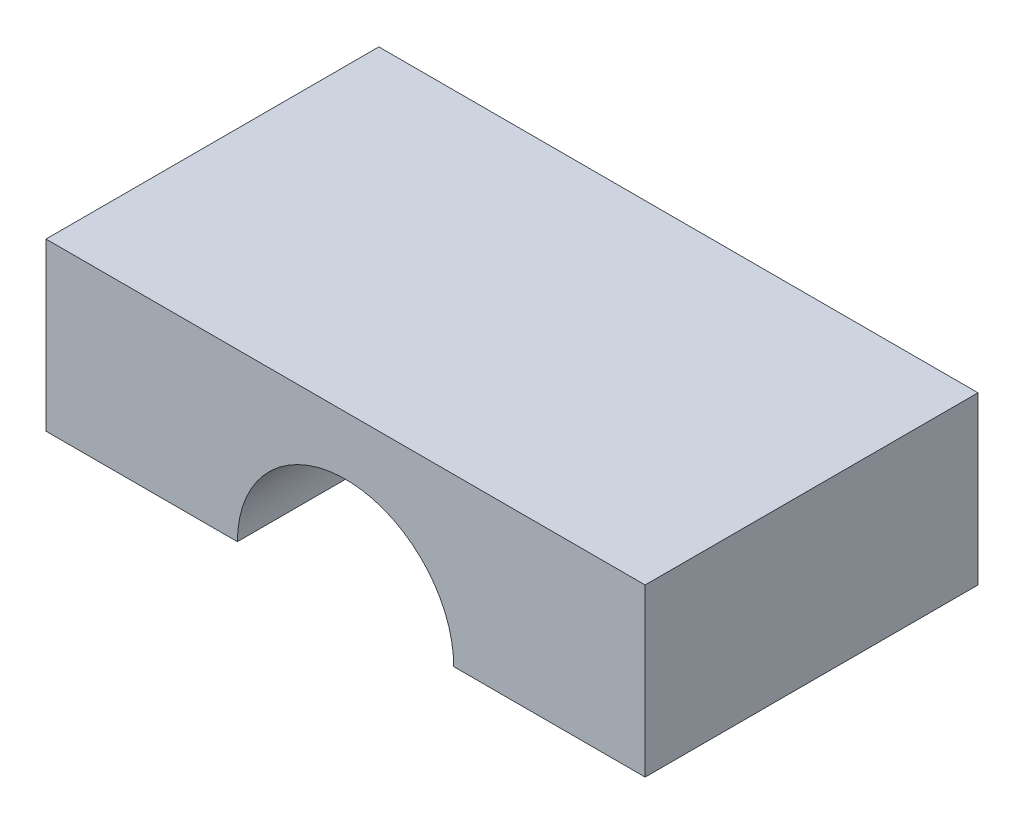
ISO-10303-21;
HEADER;
FILE_DESCRIPTION(('STEP AP214'),'2;1');
FILE_NAME('part.step','',(''),(''),'','','');
FILE_SCHEMA(('AUTOMOTIVE_DESIGN { 1 0 10303 214 1 1 1 1 }'));
ENDSEC;
DATA;
#1=APPLICATION_CONTEXT('core data for automotive mechanical design processes');
#2=APPLICATION_PROTOCOL_DEFINITION('international standard','automotive_design',2000,#1);
#3=PRODUCT_CONTEXT('',#1,'mechanical');
#4=PRODUCT('Part','Part','',(#3));
#5=PRODUCT_RELATED_PRODUCT_CATEGORY('part','',(#4));
#6=PRODUCT_DEFINITION_FORMATION('','',#4);
#7=PRODUCT_DEFINITION_CONTEXT('part definition',#1,'design');
#8=PRODUCT_DEFINITION('design','',#6,#7);
#9=PRODUCT_DEFINITION_SHAPE('','',#8);
#10=(LENGTH_UNIT() NAMED_UNIT(*) SI_UNIT(.MILLI.,.METRE.));
#11=(NAMED_UNIT(*) PLANE_ANGLE_UNIT() SI_UNIT($,.RADIAN.));
#12=(NAMED_UNIT(*) SI_UNIT($,.STERADIAN.) SOLID_ANGLE_UNIT());
#13=UNCERTAINTY_MEASURE_WITH_UNIT(LENGTH_MEASURE(1.E-05),#10,'distance_accuracy_value','');
#14=(GEOMETRIC_REPRESENTATION_CONTEXT(3) GLOBAL_UNCERTAINTY_ASSIGNED_CONTEXT((#13)) GLOBAL_UNIT_ASSIGNED_CONTEXT((#10,
#11,#12)) REPRESENTATION_CONTEXT('',''));
#15=CARTESIAN_POINT('',(0.,0.,0.));
#16=DIRECTION('',(0.,0.,1.));
#17=DIRECTION('',(1.,0.,0.));
#18=AXIS2_PLACEMENT_3D('',#15,#16,#17);
#19=CARTESIAN_POINT('',(0.,0.,10.));
#20=DIRECTION('',(0.,0.,-1.));
#21=DIRECTION('',(-1.,0.,0.));
#22=AXIS2_PLACEMENT_3D('',#19,#20,#21);
#23=CYLINDRICAL_SURFACE('',#22,3.25);
#24=CARTESIAN_POINT('',(0.,0.,0.));
#25=DIRECTION('',(0.,0.,-1.));
#26=DIRECTION('',(1.,0.,0.));
#27=AXIS2_PLACEMENT_3D('',#24,#25,#26);
#28=CIRCLE('',#27,3.25);
#29=CARTESIAN_POINT('',(-3.25,0.,0.));
#30=VERTEX_POINT('',#29);
#31=CARTESIAN_POINT('',(3.25,0.,0.));
#32=VERTEX_POINT('',#31);
#33=EDGE_CURVE('E117',#30,#32,#28,.T.);
#34=ORIENTED_EDGE('',*,*,#33,.T.);
#35=DIRECTION('',(0.,0.,-1.));
#36=VECTOR('',#35,1.);
#37=CARTESIAN_POINT('',(3.25,0.,10.));
#38=LINE('',#37,#36);
#39=CARTESIAN_POINT('',(3.25,0.,10.));
#40=VERTEX_POINT('',#39);
#41=EDGE_CURVE('E11',#40,#32,#38,.T.);
#42=ORIENTED_EDGE('',*,*,#41,.F.);
#43=CARTESIAN_POINT('',(0.,0.,10.));
#44=DIRECTION('',(0.,0.,-1.));
#45=DIRECTION('',(1.,0.,0.));
#46=AXIS2_PLACEMENT_3D('',#43,#44,#45);
#47=CIRCLE('',#46,3.25);
#48=CARTESIAN_POINT('',(-3.25,0.,10.));
#49=VERTEX_POINT('',#48);
#50=EDGE_CURVE('E127',#49,#40,#47,.T.);
#51=ORIENTED_EDGE('',*,*,#50,.F.);
#52=DIRECTION('',(0.,0.,-1.));
#53=VECTOR('',#52,1.);
#54=CARTESIAN_POINT('',(-3.25,0.,10.));
#55=LINE('',#54,#53);
#56=EDGE_CURVE('E113',#49,#30,#55,.T.);
#57=ORIENTED_EDGE('',*,*,#56,.T.);
#58=EDGE_LOOP('',(#34,#42,#51,#57));
#59=FACE_BOUND('',#58,.T.);
#60=ADVANCED_FACE('F33',(#59),#23,.F.);
#61=CARTESIAN_POINT('',(3.25,0.,10.));
#62=DIRECTION('',(0.,1.,0.));
#63=DIRECTION('',(-1.,0.,0.));
#64=AXIS2_PLACEMENT_3D('',#61,#62,#63);
#65=PLANE('',#64);
#66=DIRECTION('',(1.,0.,0.));
#67=VECTOR('',#66,1.);
#68=CARTESIAN_POINT('',(3.25,0.,0.));
#69=LINE('',#68,#67);
#70=CARTESIAN_POINT('',(9.,0.,0.));
#71=VERTEX_POINT('',#70);
#72=EDGE_CURVE('E120',#32,#71,#69,.T.);
#73=ORIENTED_EDGE('',*,*,#72,.T.);
#74=DIRECTION('',(0.,0.,-1.));
#75=VECTOR('',#74,1.);
#76=CARTESIAN_POINT('',(9.,0.,10.));
#77=LINE('',#76,#75);
#78=CARTESIAN_POINT('',(9.,0.,10.));
#79=VERTEX_POINT('',#78);
#80=EDGE_CURVE('E41',#79,#71,#77,.T.);
#81=ORIENTED_EDGE('',*,*,#80,.F.);
#82=DIRECTION('',(1.,0.,0.));
#83=VECTOR('',#82,1.);
#84=CARTESIAN_POINT('',(3.25,0.,10.));
#85=LINE('',#84,#83);
#86=EDGE_CURVE('E86',#40,#79,#85,.T.);
#87=ORIENTED_EDGE('',*,*,#86,.F.);
#88=ORIENTED_EDGE('',*,*,#41,.T.);
#89=EDGE_LOOP('',(#73,#81,#87,#88));
#90=FACE_BOUND('',#89,.T.);
#91=ADVANCED_FACE('F151',(#90),#65,.F.);
#92=CARTESIAN_POINT('',(9.,0.,10.));
#93=DIRECTION('',(-1.,0.,0.));
#94=DIRECTION('',(0.,0.,1.));
#95=AXIS2_PLACEMENT_3D('',#92,#93,#94);
#96=PLANE('',#95);
#97=DIRECTION('',(0.,1.,0.));
#98=VECTOR('',#97,1.);
#99=CARTESIAN_POINT('',(9.,0.,0.));
#100=LINE('',#99,#98);
#101=CARTESIAN_POINT('',(9.,5.,0.));
#102=VERTEX_POINT('',#101);
#103=EDGE_CURVE('E122',#71,#102,#100,.T.);
#104=ORIENTED_EDGE('',*,*,#103,.T.);
#105=DIRECTION('',(0.,0.,-1.));
#106=VECTOR('',#105,1.);
#107=CARTESIAN_POINT('',(9.,5.,10.));
#108=LINE('',#107,#106);
#109=CARTESIAN_POINT('',(9.,5.,10.));
#110=VERTEX_POINT('',#109);
#111=EDGE_CURVE('E108',#110,#102,#108,.T.);
#112=ORIENTED_EDGE('',*,*,#111,.F.);
#113=DIRECTION('',(0.,1.,0.));
#114=VECTOR('',#113,1.);
#115=CARTESIAN_POINT('',(9.,0.,10.));
#116=LINE('',#115,#114);
#117=EDGE_CURVE('E99',#79,#110,#116,.T.);
#118=ORIENTED_EDGE('',*,*,#117,.F.);
#119=ORIENTED_EDGE('',*,*,#80,.T.);
#120=EDGE_LOOP('',(#104,#112,#118,#119));
#121=FACE_BOUND('',#120,.T.);
#122=ADVANCED_FACE('F133',(#121),#96,.F.);
#123=CARTESIAN_POINT('',(9.,5.,10.));
#124=DIRECTION('',(0.,-1.,0.));
#125=DIRECTION('',(0.,0.,-1.));
#126=AXIS2_PLACEMENT_3D('',#123,#124,#125);
#127=PLANE('',#126);
#128=DIRECTION('',(-1.,0.,0.));
#129=VECTOR('',#128,1.);
#130=CARTESIAN_POINT('',(9.,5.,0.));
#131=LINE('',#130,#129);
#132=CARTESIAN_POINT('',(-9.,5.,0.));
#133=VERTEX_POINT('',#132);
#134=EDGE_CURVE('E107',#102,#133,#131,.T.);
#135=ORIENTED_EDGE('',*,*,#134,.T.);
#136=DIRECTION('',(0.,0.,-1.));
#137=VECTOR('',#136,1.);
#138=CARTESIAN_POINT('',(-9.,5.,10.));
#139=LINE('',#138,#137);
#140=CARTESIAN_POINT('',(-9.,5.,10.));
#141=VERTEX_POINT('',#140);
#142=EDGE_CURVE('E104',#141,#133,#139,.T.);
#143=ORIENTED_EDGE('',*,*,#142,.F.);
#144=DIRECTION('',(-1.,0.,0.));
#145=VECTOR('',#144,1.);
#146=CARTESIAN_POINT('',(9.,5.,10.));
#147=LINE('',#146,#145);
#148=EDGE_CURVE('E93',#110,#141,#147,.T.);
#149=ORIENTED_EDGE('',*,*,#148,.F.);
#150=ORIENTED_EDGE('',*,*,#111,.T.);
#151=EDGE_LOOP('',(#135,#143,#149,#150));
#152=FACE_BOUND('',#151,.T.);
#153=ADVANCED_FACE('F105',(#152),#127,.F.);
#154=CARTESIAN_POINT('',(-9.,0.,10.));
#155=DIRECTION('',(1.,0.,0.));
#156=DIRECTION('',(0.,0.,-1.));
#157=AXIS2_PLACEMENT_3D('',#154,#155,#156);
#158=PLANE('',#157);
#159=DIRECTION('',(0.,-1.,0.));
#160=VECTOR('',#159,1.);
#161=CARTESIAN_POINT('',(-9.,0.,0.));
#162=LINE('',#161,#160);
#163=CARTESIAN_POINT('',(-9.,0.,0.));
#164=VERTEX_POINT('',#163);
#165=EDGE_CURVE('E72',#133,#164,#162,.T.);
#166=ORIENTED_EDGE('',*,*,#165,.T.);
#167=DIRECTION('',(0.,0.,-1.));
#168=VECTOR('',#167,1.);
#169=CARTESIAN_POINT('',(-9.,0.,10.));
#170=LINE('',#169,#168);
#171=CARTESIAN_POINT('',(-9.,0.,10.));
#172=VERTEX_POINT('',#171);
#173=EDGE_CURVE('E109',#172,#164,#170,.T.);
#174=ORIENTED_EDGE('',*,*,#173,.F.);
#175=DIRECTION('',(0.,-1.,0.));
#176=VECTOR('',#175,1.);
#177=CARTESIAN_POINT('',(-9.,0.,10.));
#178=LINE('',#177,#176);
#179=EDGE_CURVE('E97',#141,#172,#178,.T.);
#180=ORIENTED_EDGE('',*,*,#179,.F.);
#181=ORIENTED_EDGE('',*,*,#142,.T.);
#182=EDGE_LOOP('',(#166,#174,#180,#181));
#183=FACE_BOUND('',#182,.T.);
#184=ADVANCED_FACE('F111',(#183),#158,.F.);
#185=CARTESIAN_POINT('',(-3.25,0.,10.));
#186=DIRECTION('',(0.,1.,0.));
#187=DIRECTION('',(-1.,0.,0.));
#188=AXIS2_PLACEMENT_3D('',#185,#186,#187);
#189=PLANE('',#188);
#190=DIRECTION('',(1.,0.,0.));
#191=VECTOR('',#190,1.);
#192=CARTESIAN_POINT('',(-3.25,0.,0.));
#193=LINE('',#192,#191);
#194=EDGE_CURVE('E78',#164,#30,#193,.T.);
#195=ORIENTED_EDGE('',*,*,#194,.T.);
#196=ORIENTED_EDGE('',*,*,#56,.F.);
#197=DIRECTION('',(1.,0.,0.));
#198=VECTOR('',#197,1.);
#199=CARTESIAN_POINT('',(-3.25,0.,10.));
#200=LINE('',#199,#198);
#201=EDGE_CURVE('E49',#172,#49,#200,.T.);
#202=ORIENTED_EDGE('',*,*,#201,.F.);
#203=ORIENTED_EDGE('',*,*,#173,.T.);
#204=EDGE_LOOP('',(#195,#196,#202,#203));
#205=FACE_BOUND('',#204,.T.);
#206=ADVANCED_FACE('F140',(#205),#189,.F.);
#207=CARTESIAN_POINT('',(0.,0.,10.));
#208=DIRECTION('',(0.,0.,1.));
#209=DIRECTION('',(1.,0.,0.));
#210=AXIS2_PLACEMENT_3D('',#207,#208,#209);
#211=PLANE('',#210);
#212=ORIENTED_EDGE('',*,*,#50,.T.);
#213=ORIENTED_EDGE('',*,*,#86,.T.);
#214=ORIENTED_EDGE('',*,*,#117,.T.);
#215=ORIENTED_EDGE('',*,*,#148,.T.);
#216=ORIENTED_EDGE('',*,*,#179,.T.);
#217=ORIENTED_EDGE('',*,*,#201,.T.);
#218=EDGE_LOOP('',(#212,#213,#214,#215,#216,#217));
#219=FACE_BOUND('',#218,.T.);
#220=ADVANCED_FACE('F95',(#219),#211,.T.);
#221=CARTESIAN_POINT('',(0.,0.,0.));
#222=DIRECTION('',(0.,0.,1.));
#223=DIRECTION('',(1.,0.,0.));
#224=AXIS2_PLACEMENT_3D('',#221,#222,#223);
#225=PLANE('',#224);
#226=ORIENTED_EDGE('',*,*,#33,.F.);
#227=ORIENTED_EDGE('',*,*,#194,.F.);
#228=ORIENTED_EDGE('',*,*,#165,.F.);
#229=ORIENTED_EDGE('',*,*,#134,.F.);
#230=ORIENTED_EDGE('',*,*,#103,.F.);
#231=ORIENTED_EDGE('',*,*,#72,.F.);
#232=EDGE_LOOP('',(#226,#227,#228,#229,#230,#231));
#233=FACE_BOUND('',#232,.T.);
#234=ADVANCED_FACE('F136',(#233),#225,.F.);
#235=CLOSED_SHELL('',(#60,#91,#122,#153,#184,#206,#220,#234));
#236=MANIFOLD_SOLID_BREP('B2',#235);
#237=ADVANCED_BREP_SHAPE_REPRESENTATION('',(#18,#236),#14);
#238=SHAPE_DEFINITION_REPRESENTATION(#9,#237);
ENDSEC;
END-ISO-10303-21;
